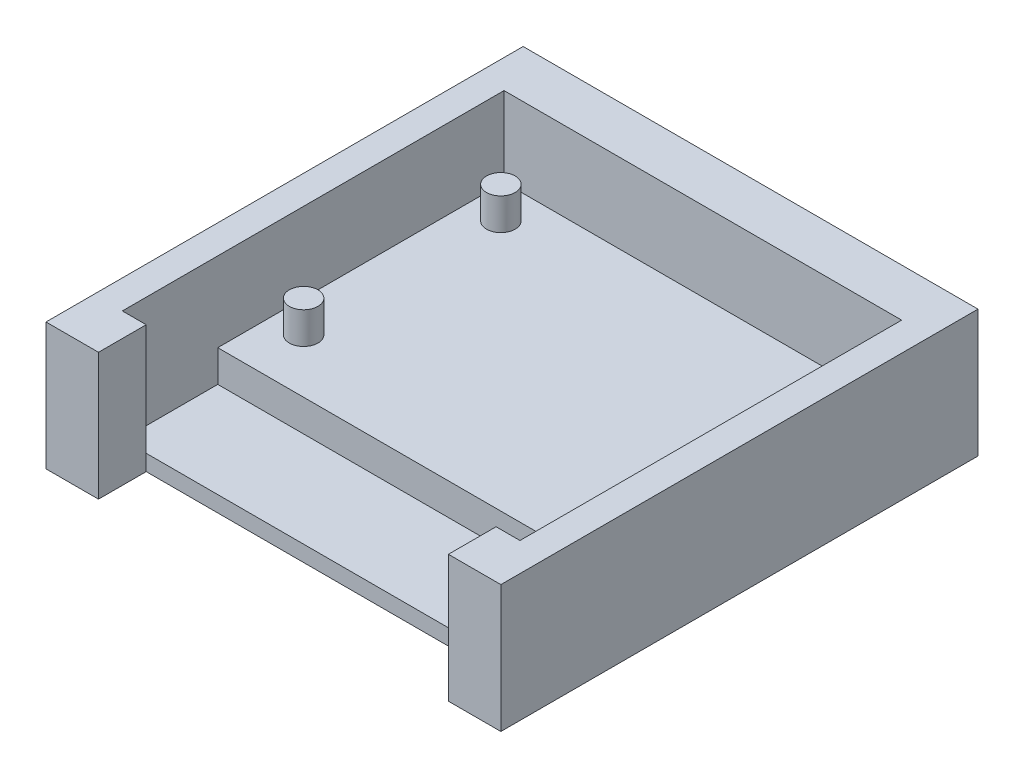
ISO-10303-21;
HEADER;
FILE_DESCRIPTION(('STEP AP214'),'2;1');
FILE_NAME('part.step','',(''),(''),'','','');
FILE_SCHEMA(('AUTOMOTIVE_DESIGN { 1 0 10303 214 1 1 1 1 }'));
ENDSEC;
DATA;
#1=APPLICATION_CONTEXT('core data for automotive mechanical design processes');
#2=APPLICATION_PROTOCOL_DEFINITION('international standard','automotive_design',2000,#1);
#3=PRODUCT_CONTEXT('',#1,'mechanical');
#4=PRODUCT('Part','Part','',(#3));
#5=PRODUCT_RELATED_PRODUCT_CATEGORY('part','',(#4));
#6=PRODUCT_DEFINITION_FORMATION('','',#4);
#7=PRODUCT_DEFINITION_CONTEXT('part definition',#1,'design');
#8=PRODUCT_DEFINITION('design','',#6,#7);
#9=PRODUCT_DEFINITION_SHAPE('','',#8);
#10=(LENGTH_UNIT() NAMED_UNIT(*) SI_UNIT(.MILLI.,.METRE.));
#11=(NAMED_UNIT(*) PLANE_ANGLE_UNIT() SI_UNIT($,.RADIAN.));
#12=(NAMED_UNIT(*) SI_UNIT($,.STERADIAN.) SOLID_ANGLE_UNIT());
#13=UNCERTAINTY_MEASURE_WITH_UNIT(LENGTH_MEASURE(1.E-05),#10,'distance_accuracy_value','');
#14=(GEOMETRIC_REPRESENTATION_CONTEXT(3) GLOBAL_UNCERTAINTY_ASSIGNED_CONTEXT((#13)) GLOBAL_UNIT_ASSIGNED_CONTEXT((#10,
#11,#12)) REPRESENTATION_CONTEXT('',''));
#15=CARTESIAN_POINT('',(0.,0.,0.));
#16=DIRECTION('',(0.,0.,1.));
#17=DIRECTION('',(1.,0.,0.));
#18=AXIS2_PLACEMENT_3D('',#15,#16,#17);
#19=CARTESIAN_POINT('',(-11.,0.,12.));
#20=DIRECTION('',(0.,0.,-1.));
#21=DIRECTION('',(-1.,0.,0.));
#22=AXIS2_PLACEMENT_3D('',#19,#20,#21);
#23=PLANE('',#22);
#24=DIRECTION('',(1.,0.,0.));
#25=VECTOR('',#24,1.);
#26=CARTESIAN_POINT('',(-12.5,1.,12.));
#27=LINE('',#26,#25);
#28=CARTESIAN_POINT('',(-11.,1.,12.));
#29=VERTEX_POINT('',#28);
#30=CARTESIAN_POINT('',(11.,1.,12.));
#31=VERTEX_POINT('',#30);
#32=EDGE_CURVE('E166',#29,#31,#27,.T.);
#33=ORIENTED_EDGE('',*,*,#32,.F.);
#34=DIRECTION('',(0.,1.,0.));
#35=VECTOR('',#34,1.);
#36=CARTESIAN_POINT('',(-11.,0.,12.));
#37=LINE('',#36,#35);
#38=CARTESIAN_POINT('',(-11.,0.,12.));
#39=VERTEX_POINT('',#38);
#40=EDGE_CURVE('E202',#39,#29,#37,.T.);
#41=ORIENTED_EDGE('',*,*,#40,.F.);
#42=DIRECTION('',(-1.,0.,0.));
#43=VECTOR('',#42,1.);
#44=CARTESIAN_POINT('',(-11.,0.,12.));
#45=LINE('',#44,#43);
#46=CARTESIAN_POINT('',(11.,0.,12.));
#47=VERTEX_POINT('',#46);
#48=EDGE_CURVE('E196',#47,#39,#45,.T.);
#49=ORIENTED_EDGE('',*,*,#48,.F.);
#50=DIRECTION('',(0.,1.,0.));
#51=VECTOR('',#50,1.);
#52=CARTESIAN_POINT('',(11.,0.,12.));
#53=LINE('',#52,#51);
#54=EDGE_CURVE('E205',#47,#31,#53,.T.);
#55=ORIENTED_EDGE('',*,*,#54,.T.);
#56=EDGE_LOOP('',(#33,#41,#49,#55));
#57=FACE_BOUND('',#56,.T.);
#58=ADVANCED_FACE('F37',(#57),#23,.F.);
#59=CARTESIAN_POINT('',(-14.3,3.,15.));
#60=DIRECTION('',(0.,0.,-1.));
#61=DIRECTION('',(-1.,0.,0.));
#62=AXIS2_PLACEMENT_3D('',#59,#60,#61);
#63=PLANE('',#62);
#64=DIRECTION('',(1.,0.,0.));
#65=VECTOR('',#64,1.);
#66=CARTESIAN_POINT('',(-14.3,0.,15.));
#67=LINE('',#66,#65);
#68=CARTESIAN_POINT('',(-14.3,0.,15.));
#69=VERTEX_POINT('',#68);
#70=CARTESIAN_POINT('',(-11.,0.,15.));
#71=VERTEX_POINT('',#70);
#72=EDGE_CURVE('E253',#69,#71,#67,.T.);
#73=ORIENTED_EDGE('',*,*,#72,.T.);
#74=DIRECTION('',(0.,1.,0.));
#75=VECTOR('',#74,1.);
#76=CARTESIAN_POINT('',(-11.,0.,15.));
#77=LINE('',#76,#75);
#78=CARTESIAN_POINT('',(-11.,8.,15.));
#79=VERTEX_POINT('',#78);
#80=EDGE_CURVE('E199',#71,#79,#77,.T.);
#81=ORIENTED_EDGE('',*,*,#80,.T.);
#82=DIRECTION('',(1.,0.,0.));
#83=VECTOR('',#82,1.);
#84=CARTESIAN_POINT('',(-14.3,8.,15.));
#85=LINE('',#84,#83);
#86=CARTESIAN_POINT('',(-14.3,8.,15.));
#87=VERTEX_POINT('',#86);
#88=EDGE_CURVE('E229',#87,#79,#85,.T.);
#89=ORIENTED_EDGE('',*,*,#88,.F.);
#90=DIRECTION('',(0.,-1.,0.));
#91=VECTOR('',#90,1.);
#92=CARTESIAN_POINT('',(-14.3,3.,15.));
#93=LINE('',#92,#91);
#94=EDGE_CURVE('E262',#87,#69,#93,.T.);
#95=ORIENTED_EDGE('',*,*,#94,.T.);
#96=EDGE_LOOP('',(#73,#81,#89,#95));
#97=FACE_BOUND('',#96,.T.);
#98=ADVANCED_FACE('F329',(#97),#63,.F.);
#99=CARTESIAN_POINT('',(-12.5,8.,12.));
#100=DIRECTION('',(0.,0.,-1.));
#101=DIRECTION('',(-1.,0.,0.));
#102=AXIS2_PLACEMENT_3D('',#99,#100,#101);
#103=PLANE('',#102);
#104=CARTESIAN_POINT('',(-11.,8.,12.));
#105=VERTEX_POINT('',#104);
#106=EDGE_CURVE('E162',#29,#105,#37,.T.);
#107=ORIENTED_EDGE('',*,*,#106,.F.);
#108=CARTESIAN_POINT('',(-12.5,1.,12.));
#109=VERTEX_POINT('',#108);
#110=EDGE_CURVE('E160',#109,#29,#27,.T.);
#111=ORIENTED_EDGE('',*,*,#110,.F.);
#112=DIRECTION('',(0.,-1.,0.));
#113=VECTOR('',#112,1.);
#114=CARTESIAN_POINT('',(-12.5,8.,12.));
#115=LINE('',#114,#113);
#116=CARTESIAN_POINT('',(-12.5,8.,12.));
#117=VERTEX_POINT('',#116);
#118=EDGE_CURVE('E145',#117,#109,#115,.T.);
#119=ORIENTED_EDGE('',*,*,#118,.F.);
#120=DIRECTION('',(1.,0.,0.));
#121=VECTOR('',#120,1.);
#122=CARTESIAN_POINT('',(-12.5,8.,12.));
#123=LINE('',#122,#121);
#124=EDGE_CURVE('E214',#117,#105,#123,.T.);
#125=ORIENTED_EDGE('',*,*,#124,.T.);
#126=EDGE_LOOP('',(#107,#111,#119,#125));
#127=FACE_BOUND('',#126,.T.);
#128=ADVANCED_FACE('F161',(#127),#103,.T.);
#129=CARTESIAN_POINT('',(-14.3,3.,-15.));
#130=DIRECTION('',(0.,0.,-1.));
#131=DIRECTION('',(-1.,0.,0.));
#132=AXIS2_PLACEMENT_3D('',#129,#130,#131);
#133=PLANE('',#132);
#134=DIRECTION('',(1.,0.,0.));
#135=VECTOR('',#134,1.);
#136=CARTESIAN_POINT('',(-14.3,0.,-15.));
#137=LINE('',#136,#135);
#138=CARTESIAN_POINT('',(-14.3,0.,-15.));
#139=VERTEX_POINT('',#138);
#140=CARTESIAN_POINT('',(14.3,0.,-15.));
#141=VERTEX_POINT('',#140);
#142=EDGE_CURVE('E246',#139,#141,#137,.T.);
#143=ORIENTED_EDGE('',*,*,#142,.F.);
#144=DIRECTION('',(0.,-1.,0.));
#145=VECTOR('',#144,1.);
#146=CARTESIAN_POINT('',(-14.3,3.,-15.));
#147=LINE('',#146,#145);
#148=CARTESIAN_POINT('',(-14.3,8.,-15.));
#149=VERTEX_POINT('',#148);
#150=EDGE_CURVE('E259',#149,#139,#147,.T.);
#151=ORIENTED_EDGE('',*,*,#150,.F.);
#152=DIRECTION('',(-1.,0.,0.));
#153=VECTOR('',#152,1.);
#154=CARTESIAN_POINT('',(-14.3,8.,-15.));
#155=LINE('',#154,#153);
#156=CARTESIAN_POINT('',(14.3,8.,-15.));
#157=VERTEX_POINT('',#156);
#158=EDGE_CURVE('E235',#157,#149,#155,.T.);
#159=ORIENTED_EDGE('',*,*,#158,.F.);
#160=DIRECTION('',(0.,-1.,0.));
#161=VECTOR('',#160,1.);
#162=CARTESIAN_POINT('',(14.3,3.,-15.));
#163=LINE('',#162,#161);
#164=EDGE_CURVE('E258',#157,#141,#163,.T.);
#165=ORIENTED_EDGE('',*,*,#164,.T.);
#166=EDGE_LOOP('',(#143,#151,#159,#165));
#167=FACE_BOUND('',#166,.T.);
#168=ADVANCED_FACE('F39',(#167),#133,.T.);
#169=CARTESIAN_POINT('',(-14.3,3.,-15.));
#170=DIRECTION('',(1.,0.,0.));
#171=DIRECTION('',(0.,0.,-1.));
#172=AXIS2_PLACEMENT_3D('',#169,#170,#171);
#173=PLANE('',#172);
#174=DIRECTION('',(0.,0.,1.));
#175=VECTOR('',#174,1.);
#176=CARTESIAN_POINT('',(-14.3,0.,-15.));
#177=LINE('',#176,#175);
#178=EDGE_CURVE('E256',#139,#69,#177,.T.);
#179=ORIENTED_EDGE('',*,*,#178,.T.);
#180=ORIENTED_EDGE('',*,*,#94,.F.);
#181=DIRECTION('',(0.,0.,1.));
#182=VECTOR('',#181,1.);
#183=CARTESIAN_POINT('',(-14.3,8.,-15.));
#184=LINE('',#183,#182);
#185=EDGE_CURVE('E156',#149,#87,#184,.T.);
#186=ORIENTED_EDGE('',*,*,#185,.F.);
#187=ORIENTED_EDGE('',*,*,#150,.T.);
#188=EDGE_LOOP('',(#179,#180,#186,#187));
#189=FACE_BOUND('',#188,.T.);
#190=ADVANCED_FACE('F325',(#189),#173,.F.);
#191=CARTESIAN_POINT('',(11.,8.,15.));
#192=VERTEX_POINT('',#191);
#193=CARTESIAN_POINT('',(14.3,8.,15.));
#194=VERTEX_POINT('',#193);
#195=EDGE_CURVE('E228',#192,#194,#85,.T.);
#196=ORIENTED_EDGE('',*,*,#195,.F.);
#197=DIRECTION('',(0.,1.,0.));
#198=VECTOR('',#197,1.);
#199=CARTESIAN_POINT('',(11.,0.,15.));
#200=LINE('',#199,#198);
#201=CARTESIAN_POINT('',(11.,0.,15.));
#202=VERTEX_POINT('',#201);
#203=EDGE_CURVE('E208',#202,#192,#200,.T.);
#204=ORIENTED_EDGE('',*,*,#203,.F.);
#205=CARTESIAN_POINT('',(14.3,0.,15.));
#206=VERTEX_POINT('',#205);
#207=EDGE_CURVE('E252',#202,#206,#67,.T.);
#208=ORIENTED_EDGE('',*,*,#207,.T.);
#209=DIRECTION('',(0.,-1.,0.));
#210=VECTOR('',#209,1.);
#211=CARTESIAN_POINT('',(14.3,3.,15.));
#212=LINE('',#211,#210);
#213=EDGE_CURVE('E265',#194,#206,#212,.T.);
#214=ORIENTED_EDGE('',*,*,#213,.F.);
#215=EDGE_LOOP('',(#196,#204,#208,#214));
#216=FACE_BOUND('',#215,.T.);
#217=ADVANCED_FACE('F310',(#216),#63,.F.);
#218=CARTESIAN_POINT('',(14.3,3.,-15.));
#219=DIRECTION('',(1.,0.,0.));
#220=DIRECTION('',(0.,0.,-1.));
#221=AXIS2_PLACEMENT_3D('',#218,#219,#220);
#222=PLANE('',#221);
#223=DIRECTION('',(0.,0.,1.));
#224=VECTOR('',#223,1.);
#225=CARTESIAN_POINT('',(14.3,0.,-15.));
#226=LINE('',#225,#224);
#227=EDGE_CURVE('E249',#141,#206,#226,.T.);
#228=ORIENTED_EDGE('',*,*,#227,.F.);
#229=ORIENTED_EDGE('',*,*,#164,.F.);
#230=DIRECTION('',(0.,0.,-1.));
#231=VECTOR('',#230,1.);
#232=CARTESIAN_POINT('',(14.3,8.,-15.));
#233=LINE('',#232,#231);
#234=EDGE_CURVE('E232',#194,#157,#233,.T.);
#235=ORIENTED_EDGE('',*,*,#234,.F.);
#236=ORIENTED_EDGE('',*,*,#213,.T.);
#237=EDGE_LOOP('',(#228,#229,#235,#236));
#238=FACE_BOUND('',#237,.T.);
#239=ADVANCED_FACE('F317',(#238),#222,.T.);
#240=CARTESIAN_POINT('',(0.,0.,0.));
#241=DIRECTION('',(0.,-1.,0.));
#242=DIRECTION('',(0.,0.,-1.));
#243=AXIS2_PLACEMENT_3D('',#240,#241,#242);
#244=PLANE('',#243);
#245=DIRECTION('',(0.,0.,1.));
#246=VECTOR('',#245,1.);
#247=CARTESIAN_POINT('',(-11.,0.,12.));
#248=LINE('',#247,#246);
#249=EDGE_CURVE('E189',#39,#71,#248,.T.);
#250=ORIENTED_EDGE('',*,*,#249,.T.);
#251=ORIENTED_EDGE('',*,*,#72,.F.);
#252=ORIENTED_EDGE('',*,*,#178,.F.);
#253=ORIENTED_EDGE('',*,*,#142,.T.);
#254=ORIENTED_EDGE('',*,*,#227,.T.);
#255=ORIENTED_EDGE('',*,*,#207,.F.);
#256=DIRECTION('',(0.,0.,-1.));
#257=VECTOR('',#256,1.);
#258=CARTESIAN_POINT('',(11.,0.,12.));
#259=LINE('',#258,#257);
#260=EDGE_CURVE('E192',#202,#47,#259,.T.);
#261=ORIENTED_EDGE('',*,*,#260,.T.);
#262=ORIENTED_EDGE('',*,*,#48,.T.);
#263=EDGE_LOOP('',(#250,#251,#252,#253,#254,#255,#261,#262));
#264=FACE_BOUND('',#263,.T.);
#265=ADVANCED_FACE('F312',(#264),#244,.T.);
#266=CARTESIAN_POINT('',(-12.5,8.,-12.));
#267=DIRECTION('',(1.,0.,0.));
#268=DIRECTION('',(0.,0.,-1.));
#269=AXIS2_PLACEMENT_3D('',#266,#267,#268);
#270=PLANE('',#269);
#271=DIRECTION('',(0.,0.,1.));
#272=VECTOR('',#271,1.);
#273=CARTESIAN_POINT('',(-12.5,3.,0.));
#274=LINE('',#273,#272);
#275=CARTESIAN_POINT('',(-12.5,3.,-12.));
#276=VERTEX_POINT('',#275);
#277=CARTESIAN_POINT('',(-12.5,3.,6.));
#278=VERTEX_POINT('',#277);
#279=EDGE_CURVE('E243',#276,#278,#274,.T.);
#280=ORIENTED_EDGE('',*,*,#279,.F.);
#281=DIRECTION('',(0.,-1.,0.));
#282=VECTOR('',#281,1.);
#283=CARTESIAN_POINT('',(-12.5,8.,-12.));
#284=LINE('',#283,#282);
#285=CARTESIAN_POINT('',(-12.5,8.,-12.));
#286=VERTEX_POINT('',#285);
#287=EDGE_CURVE('E60',#286,#276,#284,.T.);
#288=ORIENTED_EDGE('',*,*,#287,.F.);
#289=DIRECTION('',(0.,0.,1.));
#290=VECTOR('',#289,1.);
#291=CARTESIAN_POINT('',(-12.5,8.,-12.));
#292=LINE('',#291,#290);
#293=EDGE_CURVE('E152',#286,#117,#292,.T.);
#294=ORIENTED_EDGE('',*,*,#293,.T.);
#295=ORIENTED_EDGE('',*,*,#118,.T.);
#296=DIRECTION('',(0.,0.,1.));
#297=VECTOR('',#296,1.);
#298=CARTESIAN_POINT('',(-12.5,1.,6.));
#299=LINE('',#298,#297);
#300=CARTESIAN_POINT('',(-12.5,1.,6.));
#301=VERTEX_POINT('',#300);
#302=EDGE_CURVE('E149',#301,#109,#299,.T.);
#303=ORIENTED_EDGE('',*,*,#302,.F.);
#304=DIRECTION('',(0.,1.,0.));
#305=VECTOR('',#304,1.);
#306=CARTESIAN_POINT('',(-12.5,1.,6.));
#307=LINE('',#306,#305);
#308=EDGE_CURVE('E185',#301,#278,#307,.T.);
#309=ORIENTED_EDGE('',*,*,#308,.T.);
#310=EDGE_LOOP('',(#280,#288,#294,#295,#303,#309));
#311=FACE_BOUND('',#310,.T.);
#312=ADVANCED_FACE('F147',(#311),#270,.T.);
#313=CARTESIAN_POINT('',(11.,8.,12.));
#314=VERTEX_POINT('',#313);
#315=EDGE_CURVE('E52',#31,#314,#53,.T.);
#316=ORIENTED_EDGE('',*,*,#315,.T.);
#317=CARTESIAN_POINT('',(12.5,8.,12.));
#318=VERTEX_POINT('',#317);
#319=EDGE_CURVE('E213',#314,#318,#123,.T.);
#320=ORIENTED_EDGE('',*,*,#319,.T.);
#321=DIRECTION('',(0.,-1.,0.));
#322=VECTOR('',#321,1.);
#323=CARTESIAN_POINT('',(12.5,8.,12.));
#324=LINE('',#323,#322);
#325=CARTESIAN_POINT('',(12.5,1.,12.));
#326=VERTEX_POINT('',#325);
#327=EDGE_CURVE('E157',#318,#326,#324,.T.);
#328=ORIENTED_EDGE('',*,*,#327,.T.);
#329=EDGE_CURVE('E168',#31,#326,#27,.T.);
#330=ORIENTED_EDGE('',*,*,#329,.F.);
#331=EDGE_LOOP('',(#316,#320,#328,#330));
#332=FACE_BOUND('',#331,.T.);
#333=ADVANCED_FACE('F299',(#332),#103,.T.);
#334=CARTESIAN_POINT('',(12.5,8.,-12.));
#335=DIRECTION('',(-1.,0.,0.));
#336=DIRECTION('',(0.,0.,1.));
#337=AXIS2_PLACEMENT_3D('',#334,#335,#336);
#338=PLANE('',#337);
#339=DIRECTION('',(0.,0.,-1.));
#340=VECTOR('',#339,1.);
#341=CARTESIAN_POINT('',(12.5,3.,0.));
#342=LINE('',#341,#340);
#343=CARTESIAN_POINT('',(12.5,3.,6.00000000000001));
#344=VERTEX_POINT('',#343);
#345=CARTESIAN_POINT('',(12.5,3.,-12.));
#346=VERTEX_POINT('',#345);
#347=EDGE_CURVE('E241',#344,#346,#342,.T.);
#348=ORIENTED_EDGE('',*,*,#347,.F.);
#349=DIRECTION('',(0.,1.,0.));
#350=VECTOR('',#349,1.);
#351=CARTESIAN_POINT('',(12.5,1.,6.00000000000001));
#352=LINE('',#351,#350);
#353=CARTESIAN_POINT('',(12.5,1.,6.00000000000001));
#354=VERTEX_POINT('',#353);
#355=EDGE_CURVE('E183',#354,#344,#352,.T.);
#356=ORIENTED_EDGE('',*,*,#355,.F.);
#357=DIRECTION('',(0.,0.,-1.));
#358=VECTOR('',#357,1.);
#359=CARTESIAN_POINT('',(12.5,1.,6.00000000000001));
#360=LINE('',#359,#358);
#361=EDGE_CURVE('E165',#326,#354,#360,.T.);
#362=ORIENTED_EDGE('',*,*,#361,.F.);
#363=ORIENTED_EDGE('',*,*,#327,.F.);
#364=DIRECTION('',(0.,0.,-1.));
#365=VECTOR('',#364,1.);
#366=CARTESIAN_POINT('',(12.5,8.,-12.));
#367=LINE('',#366,#365);
#368=CARTESIAN_POINT('',(12.5,8.,-12.));
#369=VERTEX_POINT('',#368);
#370=EDGE_CURVE('E216',#318,#369,#367,.T.);
#371=ORIENTED_EDGE('',*,*,#370,.T.);
#372=DIRECTION('',(0.,-1.,0.));
#373=VECTOR('',#372,1.);
#374=CARTESIAN_POINT('',(12.5,8.,-12.));
#375=LINE('',#374,#373);
#376=EDGE_CURVE('E222',#369,#346,#375,.T.);
#377=ORIENTED_EDGE('',*,*,#376,.T.);
#378=EDGE_LOOP('',(#348,#356,#362,#363,#371,#377));
#379=FACE_BOUND('',#378,.T.);
#380=ADVANCED_FACE('F295',(#379),#338,.T.);
#381=CARTESIAN_POINT('',(-12.5,8.,-12.));
#382=DIRECTION('',(0.,0.,1.));
#383=DIRECTION('',(1.,0.,0.));
#384=AXIS2_PLACEMENT_3D('',#381,#382,#383);
#385=PLANE('',#384);
#386=DIRECTION('',(-1.,0.,0.));
#387=VECTOR('',#386,1.);
#388=CARTESIAN_POINT('',(0.,3.,-12.));
#389=LINE('',#388,#387);
#390=EDGE_CURVE('E238',#346,#276,#389,.T.);
#391=ORIENTED_EDGE('',*,*,#390,.F.);
#392=ORIENTED_EDGE('',*,*,#376,.F.);
#393=DIRECTION('',(-1.,0.,0.));
#394=VECTOR('',#393,1.);
#395=CARTESIAN_POINT('',(-12.5,8.,-12.));
#396=LINE('',#395,#394);
#397=EDGE_CURVE('E219',#369,#286,#396,.T.);
#398=ORIENTED_EDGE('',*,*,#397,.T.);
#399=ORIENTED_EDGE('',*,*,#287,.T.);
#400=EDGE_LOOP('',(#391,#392,#398,#399));
#401=FACE_BOUND('',#400,.T.);
#402=ADVANCED_FACE('F455',(#401),#385,.T.);
#403=CARTESIAN_POINT('',(0.,8.,0.));
#404=DIRECTION('',(0.,1.,0.));
#405=DIRECTION('',(0.,0.,1.));
#406=AXIS2_PLACEMENT_3D('',#403,#404,#405);
#407=PLANE('',#406);
#408=DIRECTION('',(0.,0.,1.));
#409=VECTOR('',#408,1.);
#410=CARTESIAN_POINT('',(-11.,8.,12.));
#411=LINE('',#410,#409);
#412=EDGE_CURVE('E187',#105,#79,#411,.T.);
#413=ORIENTED_EDGE('',*,*,#412,.F.);
#414=ORIENTED_EDGE('',*,*,#124,.F.);
#415=ORIENTED_EDGE('',*,*,#293,.F.);
#416=ORIENTED_EDGE('',*,*,#397,.F.);
#417=ORIENTED_EDGE('',*,*,#370,.F.);
#418=ORIENTED_EDGE('',*,*,#319,.F.);
#419=DIRECTION('',(0.,0.,-1.));
#420=VECTOR('',#419,1.);
#421=CARTESIAN_POINT('',(11.,8.,12.));
#422=LINE('',#421,#420);
#423=EDGE_CURVE('E193',#192,#314,#422,.T.);
#424=ORIENTED_EDGE('',*,*,#423,.F.);
#425=ORIENTED_EDGE('',*,*,#195,.T.);
#426=ORIENTED_EDGE('',*,*,#234,.T.);
#427=ORIENTED_EDGE('',*,*,#158,.T.);
#428=ORIENTED_EDGE('',*,*,#185,.T.);
#429=ORIENTED_EDGE('',*,*,#88,.T.);
#430=EDGE_LOOP('',(#413,#414,#415,#416,#417,#418,#424,#425,#426,#427,#428,#429));
#431=FACE_BOUND('',#430,.T.);
#432=ADVANCED_FACE('F282',(#431),#407,.T.);
#433=CARTESIAN_POINT('',(0.,3.,0.));
#434=DIRECTION('',(0.,-1.,0.));
#435=DIRECTION('',(0.,0.,-1.));
#436=AXIS2_PLACEMENT_3D('',#433,#434,#435);
#437=PLANE('',#436);
#438=CARTESIAN_POINT('',(10.5,3.,2.6));
#439=DIRECTION('',(0.,-1.,0.));
#440=DIRECTION('',(0.,0.,-1.));
#441=AXIS2_PLACEMENT_3D('',#438,#439,#440);
#442=CIRCLE('',#441,0.9);
#443=CARTESIAN_POINT('',(10.5,3.,1.7));
#444=VERTEX_POINT('',#443);
#445=EDGE_CURVE('E11',#444,#444,#442,.F.);
#446=ORIENTED_EDGE('',*,*,#445,.F.);
#447=EDGE_LOOP('',(#446));
#448=FACE_BOUND('',#447,.T.);
#449=CARTESIAN_POINT('',(10.5,3.,-9.8));
#450=DIRECTION('',(0.,-1.,0.));
#451=DIRECTION('',(0.,0.,-1.));
#452=AXIS2_PLACEMENT_3D('',#449,#450,#451);
#453=CIRCLE('',#452,0.9);
#454=CARTESIAN_POINT('',(10.5,3.,-10.7));
#455=VERTEX_POINT('',#454);
#456=EDGE_CURVE('E45',#455,#455,#453,.F.);
#457=ORIENTED_EDGE('',*,*,#456,.F.);
#458=EDGE_LOOP('',(#457));
#459=FACE_BOUND('',#458,.T.);
#460=CARTESIAN_POINT('',(-10.5,3.,2.6));
#461=DIRECTION('',(0.,-1.,0.));
#462=DIRECTION('',(0.,0.,-1.));
#463=AXIS2_PLACEMENT_3D('',#460,#461,#462);
#464=CIRCLE('',#463,0.9);
#465=CARTESIAN_POINT('',(-10.5,3.,1.7));
#466=VERTEX_POINT('',#465);
#467=EDGE_CURVE('E271',#466,#466,#464,.F.);
#468=ORIENTED_EDGE('',*,*,#467,.F.);
#469=EDGE_LOOP('',(#468));
#470=FACE_BOUND('',#469,.T.);
#471=CARTESIAN_POINT('',(-10.5,3.,-9.8));
#472=DIRECTION('',(0.,-1.,0.));
#473=DIRECTION('',(0.,0.,-1.));
#474=AXIS2_PLACEMENT_3D('',#471,#472,#473);
#475=CIRCLE('',#474,0.9);
#476=CARTESIAN_POINT('',(-10.5,3.,-10.7));
#477=VERTEX_POINT('',#476);
#478=EDGE_CURVE('E261',#477,#477,#475,.F.);
#479=ORIENTED_EDGE('',*,*,#478,.F.);
#480=EDGE_LOOP('',(#479));
#481=FACE_BOUND('',#480,.T.);
#482=ORIENTED_EDGE('',*,*,#279,.T.);
#483=DIRECTION('',(-1.,0.,0.));
#484=VECTOR('',#483,1.);
#485=CARTESIAN_POINT('',(-12.5,3.,6.));
#486=LINE('',#485,#484);
#487=EDGE_CURVE('E173',#344,#278,#486,.T.);
#488=ORIENTED_EDGE('',*,*,#487,.F.);
#489=ORIENTED_EDGE('',*,*,#347,.T.);
#490=ORIENTED_EDGE('',*,*,#390,.T.);
#491=EDGE_LOOP('',(#482,#488,#489,#490));
#492=FACE_BOUND('',#491,.T.);
#493=ADVANCED_FACE('F278',(#448,#459,#470,#481,#492),#437,.F.);
#494=CARTESIAN_POINT('',(-11.,0.,12.));
#495=DIRECTION('',(-1.,0.,0.));
#496=DIRECTION('',(0.,0.,1.));
#497=AXIS2_PLACEMENT_3D('',#494,#495,#496);
#498=PLANE('',#497);
#499=ORIENTED_EDGE('',*,*,#412,.T.);
#500=ORIENTED_EDGE('',*,*,#80,.F.);
#501=ORIENTED_EDGE('',*,*,#249,.F.);
#502=ORIENTED_EDGE('',*,*,#40,.T.);
#503=ORIENTED_EDGE('',*,*,#106,.T.);
#504=EDGE_LOOP('',(#499,#500,#501,#502,#503));
#505=FACE_BOUND('',#504,.T.);
#506=ADVANCED_FACE('F281',(#505),#498,.F.);
#507=CARTESIAN_POINT('',(11.,0.,12.));
#508=DIRECTION('',(1.,0.,0.));
#509=DIRECTION('',(0.,0.,-1.));
#510=AXIS2_PLACEMENT_3D('',#507,#508,#509);
#511=PLANE('',#510);
#512=ORIENTED_EDGE('',*,*,#423,.T.);
#513=ORIENTED_EDGE('',*,*,#315,.F.);
#514=ORIENTED_EDGE('',*,*,#54,.F.);
#515=ORIENTED_EDGE('',*,*,#260,.F.);
#516=ORIENTED_EDGE('',*,*,#203,.T.);
#517=EDGE_LOOP('',(#512,#513,#514,#515,#516));
#518=FACE_BOUND('',#517,.T.);
#519=ADVANCED_FACE('F303',(#518),#511,.F.);
#520=CARTESIAN_POINT('',(-12.5,1.,6.));
#521=DIRECTION('',(0.,0.,-1.));
#522=DIRECTION('',(-1.,0.,0.));
#523=AXIS2_PLACEMENT_3D('',#520,#521,#522);
#524=PLANE('',#523);
#525=ORIENTED_EDGE('',*,*,#487,.T.);
#526=ORIENTED_EDGE('',*,*,#308,.F.);
#527=DIRECTION('',(-1.,0.,0.));
#528=VECTOR('',#527,1.);
#529=CARTESIAN_POINT('',(-12.5,1.,6.));
#530=LINE('',#529,#528);
#531=EDGE_CURVE('E172',#354,#301,#530,.T.);
#532=ORIENTED_EDGE('',*,*,#531,.F.);
#533=ORIENTED_EDGE('',*,*,#355,.T.);
#534=EDGE_LOOP('',(#525,#526,#532,#533));
#535=FACE_BOUND('',#534,.T.);
#536=ADVANCED_FACE('F292',(#535),#524,.F.);
#537=CARTESIAN_POINT('',(0.,1.,0.));
#538=DIRECTION('',(0.,1.,0.));
#539=DIRECTION('',(0.,0.,1.));
#540=AXIS2_PLACEMENT_3D('',#537,#538,#539);
#541=PLANE('',#540);
#542=ORIENTED_EDGE('',*,*,#302,.T.);
#543=ORIENTED_EDGE('',*,*,#110,.T.);
#544=ORIENTED_EDGE('',*,*,#32,.T.);
#545=ORIENTED_EDGE('',*,*,#329,.T.);
#546=ORIENTED_EDGE('',*,*,#361,.T.);
#547=ORIENTED_EDGE('',*,*,#531,.T.);
#548=EDGE_LOOP('',(#542,#543,#544,#545,#546,#547));
#549=FACE_BOUND('',#548,.T.);
#550=ADVANCED_FACE('F169',(#549),#541,.T.);
#551=CARTESIAN_POINT('',(-10.5,5.,-9.8));
#552=DIRECTION('',(0.,-1.,0.));
#553=DIRECTION('',(0.,0.,-1.));
#554=AXIS2_PLACEMENT_3D('',#551,#552,#553);
#555=CYLINDRICAL_SURFACE('',#554,0.9);
#556=CARTESIAN_POINT('',(-10.5,5.,-9.8));
#557=DIRECTION('',(0.,1.,0.));
#558=DIRECTION('',(0.,0.,1.));
#559=AXIS2_PLACEMENT_3D('',#556,#557,#558);
#560=CIRCLE('',#559,0.9);
#561=CARTESIAN_POINT('',(-10.5,5.,-8.9));
#562=VERTEX_POINT('',#561);
#563=EDGE_CURVE('E177',#562,#562,#560,.T.);
#564=ORIENTED_EDGE('',*,*,#563,.F.);
#565=EDGE_LOOP('',(#564));
#566=FACE_BOUND('',#565,.T.);
#567=ORIENTED_EDGE('',*,*,#478,.T.);
#568=EDGE_LOOP('',(#567));
#569=FACE_BOUND('',#568,.T.);
#570=ADVANCED_FACE('F350',(#566,#569),#555,.T.);
#571=CARTESIAN_POINT('',(-10.5,5.,-9.8));
#572=DIRECTION('',(0.,1.,0.));
#573=DIRECTION('',(0.,0.,1.));
#574=AXIS2_PLACEMENT_3D('',#571,#572,#573);
#575=PLANE('',#574);
#576=ORIENTED_EDGE('',*,*,#563,.T.);
#577=EDGE_LOOP('',(#576));
#578=FACE_BOUND('',#577,.T.);
#579=ADVANCED_FACE('F353',(#578),#575,.T.);
#580=CARTESIAN_POINT('',(-10.5,5.,2.6));
#581=DIRECTION('',(0.,-1.,0.));
#582=DIRECTION('',(0.,0.,-1.));
#583=AXIS2_PLACEMENT_3D('',#580,#581,#582);
#584=CYLINDRICAL_SURFACE('',#583,0.9);
#585=CARTESIAN_POINT('',(-10.5,5.,2.6));
#586=DIRECTION('',(0.,1.,0.));
#587=DIRECTION('',(0.,0.,1.));
#588=AXIS2_PLACEMENT_3D('',#585,#586,#587);
#589=CIRCLE('',#588,0.9);
#590=CARTESIAN_POINT('',(-10.5,5.,3.5));
#591=VERTEX_POINT('',#590);
#592=EDGE_CURVE('E388',#591,#591,#589,.T.);
#593=ORIENTED_EDGE('',*,*,#592,.F.);
#594=EDGE_LOOP('',(#593));
#595=FACE_BOUND('',#594,.T.);
#596=ORIENTED_EDGE('',*,*,#467,.T.);
#597=EDGE_LOOP('',(#596));
#598=FACE_BOUND('',#597,.T.);
#599=ADVANCED_FACE('F357',(#595,#598),#584,.T.);
#600=CARTESIAN_POINT('',(-10.5,5.,2.6));
#601=DIRECTION('',(0.,1.,0.));
#602=DIRECTION('',(0.,0.,1.));
#603=AXIS2_PLACEMENT_3D('',#600,#601,#602);
#604=PLANE('',#603);
#605=ORIENTED_EDGE('',*,*,#592,.T.);
#606=EDGE_LOOP('',(#605));
#607=FACE_BOUND('',#606,.T.);
#608=ADVANCED_FACE('F361',(#607),#604,.T.);
#609=CARTESIAN_POINT('',(10.5,5.,-9.8));
#610=DIRECTION('',(0.,-1.,0.));
#611=DIRECTION('',(0.,0.,-1.));
#612=AXIS2_PLACEMENT_3D('',#609,#610,#611);
#613=CYLINDRICAL_SURFACE('',#612,0.9);
#614=CARTESIAN_POINT('',(10.5,5.,-9.8));
#615=DIRECTION('',(0.,1.,0.));
#616=DIRECTION('',(0.,0.,1.));
#617=AXIS2_PLACEMENT_3D('',#614,#615,#616);
#618=CIRCLE('',#617,0.9);
#619=CARTESIAN_POINT('',(10.5,5.,-8.9));
#620=VERTEX_POINT('',#619);
#621=EDGE_CURVE('E385',#620,#620,#618,.T.);
#622=ORIENTED_EDGE('',*,*,#621,.F.);
#623=EDGE_LOOP('',(#622));
#624=FACE_BOUND('',#623,.T.);
#625=ORIENTED_EDGE('',*,*,#456,.T.);
#626=EDGE_LOOP('',(#625));
#627=FACE_BOUND('',#626,.T.);
#628=ADVANCED_FACE('F276',(#624,#627),#613,.T.);
#629=CARTESIAN_POINT('',(10.5,5.,-9.8));
#630=DIRECTION('',(0.,1.,0.));
#631=DIRECTION('',(0.,0.,1.));
#632=AXIS2_PLACEMENT_3D('',#629,#630,#631);
#633=PLANE('',#632);
#634=ORIENTED_EDGE('',*,*,#621,.T.);
#635=EDGE_LOOP('',(#634));
#636=FACE_BOUND('',#635,.T.);
#637=ADVANCED_FACE('F368',(#636),#633,.T.);
#638=CARTESIAN_POINT('',(10.5,5.,2.6));
#639=DIRECTION('',(0.,-1.,0.));
#640=DIRECTION('',(0.,0.,-1.));
#641=AXIS2_PLACEMENT_3D('',#638,#639,#640);
#642=CYLINDRICAL_SURFACE('',#641,0.9);
#643=CARTESIAN_POINT('',(10.5,5.,2.6));
#644=DIRECTION('',(0.,1.,0.));
#645=DIRECTION('',(0.,0.,1.));
#646=AXIS2_PLACEMENT_3D('',#643,#644,#645);
#647=CIRCLE('',#646,0.9);
#648=CARTESIAN_POINT('',(10.5,5.,3.5));
#649=VERTEX_POINT('',#648);
#650=EDGE_CURVE('E384',#649,#649,#647,.T.);
#651=ORIENTED_EDGE('',*,*,#650,.F.);
#652=EDGE_LOOP('',(#651));
#653=FACE_BOUND('',#652,.T.);
#654=ORIENTED_EDGE('',*,*,#445,.T.);
#655=EDGE_LOOP('',(#654));
#656=FACE_BOUND('',#655,.T.);
#657=ADVANCED_FACE('F372',(#653,#656),#642,.T.);
#658=CARTESIAN_POINT('',(10.5,5.,2.6));
#659=DIRECTION('',(0.,1.,0.));
#660=DIRECTION('',(0.,0.,1.));
#661=AXIS2_PLACEMENT_3D('',#658,#659,#660);
#662=PLANE('',#661);
#663=ORIENTED_EDGE('',*,*,#650,.T.);
#664=EDGE_LOOP('',(#663));
#665=FACE_BOUND('',#664,.T.);
#666=ADVANCED_FACE('F376',(#665),#662,.T.);
#667=CLOSED_SHELL('',(#58,#98,#128,#168,#190,#217,#239,#265,#312,#333,#380,#402,#432,#493,#506,
#519,#536,#550,#570,#579,#599,#608,#628,#637,#657,#666));
#668=MANIFOLD_SOLID_BREP('B2',#667);
#669=ADVANCED_BREP_SHAPE_REPRESENTATION('',(#18,#668),#14);
#670=SHAPE_DEFINITION_REPRESENTATION(#9,#669);
ENDSEC;
END-ISO-10303-21;
